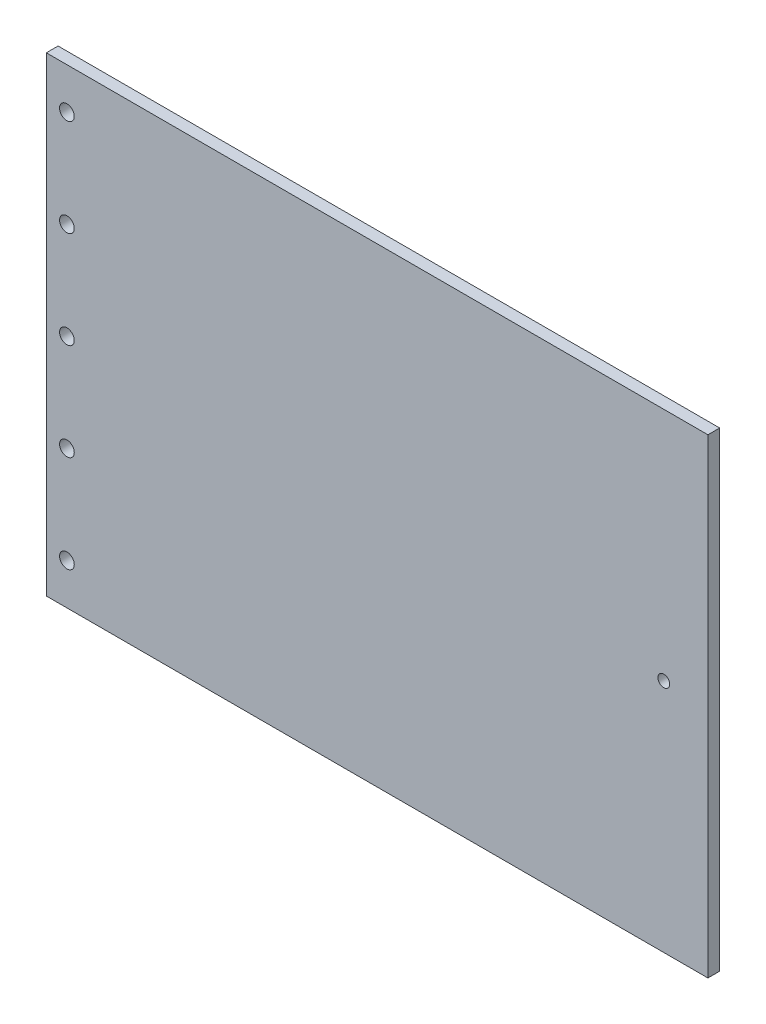
ISO-10303-21;
HEADER;
FILE_DESCRIPTION(('STEP AP214'),'2;1');
FILE_NAME('part.step','',(''),(''),'','','');
FILE_SCHEMA(('AUTOMOTIVE_DESIGN { 1 0 10303 214 1 1 1 1 }'));
ENDSEC;
DATA;
#1=APPLICATION_CONTEXT('core data for automotive mechanical design processes');
#2=APPLICATION_PROTOCOL_DEFINITION('international standard','automotive_design',2000,#1);
#3=PRODUCT_CONTEXT('',#1,'mechanical');
#4=PRODUCT('Part','Part','',(#3));
#5=PRODUCT_RELATED_PRODUCT_CATEGORY('part','',(#4));
#6=PRODUCT_DEFINITION_FORMATION('','',#4);
#7=PRODUCT_DEFINITION_CONTEXT('part definition',#1,'design');
#8=PRODUCT_DEFINITION('design','',#6,#7);
#9=PRODUCT_DEFINITION_SHAPE('','',#8);
#10=(LENGTH_UNIT() NAMED_UNIT(*) SI_UNIT(.MILLI.,.METRE.));
#11=(NAMED_UNIT(*) PLANE_ANGLE_UNIT() SI_UNIT($,.RADIAN.));
#12=(NAMED_UNIT(*) SI_UNIT($,.STERADIAN.) SOLID_ANGLE_UNIT());
#13=UNCERTAINTY_MEASURE_WITH_UNIT(LENGTH_MEASURE(1.E-05),#10,'distance_accuracy_value','');
#14=(GEOMETRIC_REPRESENTATION_CONTEXT(3) GLOBAL_UNCERTAINTY_ASSIGNED_CONTEXT((#13)) GLOBAL_UNIT_ASSIGNED_CONTEXT((#10,
#11,#12)) REPRESENTATION_CONTEXT('',''));
#15=CARTESIAN_POINT('',(0.,0.,0.));
#16=DIRECTION('',(0.,0.,1.));
#17=DIRECTION('',(1.,0.,0.));
#18=AXIS2_PLACEMENT_3D('',#15,#16,#17);
#19=CARTESIAN_POINT('',(0.,0.,4.));
#20=DIRECTION('',(0.,0.,-1.));
#21=DIRECTION('',(-1.,0.,0.));
#22=AXIS2_PLACEMENT_3D('',#19,#20,#21);
#23=PLANE('',#22);
#24=CARTESIAN_POINT('',(210.,80.,4.));
#25=DIRECTION('',(0.,0.,1.));
#26=DIRECTION('',(1.,0.,0.));
#27=AXIS2_PLACEMENT_3D('',#24,#25,#26);
#28=CIRCLE('',#27,2.);
#29=CARTESIAN_POINT('',(212.,80.,4.));
#30=VERTEX_POINT('',#29);
#31=EDGE_CURVE('E144',#30,#30,#28,.T.);
#32=ORIENTED_EDGE('',*,*,#31,.F.);
#33=EDGE_LOOP('',(#32));
#34=FACE_BOUND('',#33,.T.);
#35=DIRECTION('',(0.,-1.,0.));
#36=VECTOR('',#35,1.);
#37=CARTESIAN_POINT('',(0.,0.,4.));
#38=LINE('',#37,#36);
#39=CARTESIAN_POINT('',(0.,160.,4.));
#40=VERTEX_POINT('',#39);
#41=CARTESIAN_POINT('',(0.,0.,4.));
#42=VERTEX_POINT('',#41);
#43=EDGE_CURVE('E87',#40,#42,#38,.T.);
#44=ORIENTED_EDGE('',*,*,#43,.T.);
#45=DIRECTION('',(1.,0.,0.));
#46=VECTOR('',#45,1.);
#47=CARTESIAN_POINT('',(0.,0.,4.));
#48=LINE('',#47,#46);
#49=CARTESIAN_POINT('',(225.,0.,4.));
#50=VERTEX_POINT('',#49);
#51=EDGE_CURVE('E82',#42,#50,#48,.T.);
#52=ORIENTED_EDGE('',*,*,#51,.T.);
#53=DIRECTION('',(0.,1.,0.));
#54=VECTOR('',#53,1.);
#55=CARTESIAN_POINT('',(225.,0.,4.));
#56=LINE('',#55,#54);
#57=CARTESIAN_POINT('',(225.,160.,4.));
#58=VERTEX_POINT('',#57);
#59=EDGE_CURVE('E85',#50,#58,#56,.T.);
#60=ORIENTED_EDGE('',*,*,#59,.T.);
#61=DIRECTION('',(-1.,0.,0.));
#62=VECTOR('',#61,1.);
#63=CARTESIAN_POINT('',(0.,160.,4.));
#64=LINE('',#63,#62);
#65=EDGE_CURVE('E52',#58,#40,#64,.T.);
#66=ORIENTED_EDGE('',*,*,#65,.T.);
#67=EDGE_LOOP('',(#44,#52,#60,#66));
#68=FACE_BOUND('',#67,.T.);
#69=CARTESIAN_POINT('',(7.,80.,4.));
#70=DIRECTION('',(0.,0.,1.));
#71=DIRECTION('',(1.,0.,0.));
#72=AXIS2_PLACEMENT_3D('',#69,#70,#71);
#73=CIRCLE('',#72,2.5);
#74=CARTESIAN_POINT('',(9.5,80.,4.));
#75=VERTEX_POINT('',#74);
#76=EDGE_CURVE('E102',#75,#75,#73,.T.);
#77=ORIENTED_EDGE('',*,*,#76,.F.);
#78=EDGE_LOOP('',(#77));
#79=FACE_BOUND('',#78,.T.);
#80=CARTESIAN_POINT('',(7.00000000000001,47.,4.));
#81=DIRECTION('',(0.,0.,1.));
#82=DIRECTION('',(1.,0.,0.));
#83=AXIS2_PLACEMENT_3D('',#80,#81,#82);
#84=CIRCLE('',#83,2.5);
#85=CARTESIAN_POINT('',(9.50000000000001,47.,4.));
#86=VERTEX_POINT('',#85);
#87=EDGE_CURVE('E117',#86,#86,#84,.T.);
#88=ORIENTED_EDGE('',*,*,#87,.F.);
#89=EDGE_LOOP('',(#88));
#90=FACE_BOUND('',#89,.T.);
#91=CARTESIAN_POINT('',(7.00000000000001,14.,4.));
#92=DIRECTION('',(0.,0.,1.));
#93=DIRECTION('',(1.,0.,0.));
#94=AXIS2_PLACEMENT_3D('',#91,#92,#93);
#95=CIRCLE('',#94,2.5);
#96=CARTESIAN_POINT('',(9.50000000000001,14.,4.));
#97=VERTEX_POINT('',#96);
#98=EDGE_CURVE('E123',#97,#97,#95,.T.);
#99=ORIENTED_EDGE('',*,*,#98,.F.);
#100=EDGE_LOOP('',(#99));
#101=FACE_BOUND('',#100,.T.);
#102=CARTESIAN_POINT('',(7.,113.,4.));
#103=DIRECTION('',(0.,0.,1.));
#104=DIRECTION('',(1.,0.,0.));
#105=AXIS2_PLACEMENT_3D('',#102,#103,#104);
#106=CIRCLE('',#105,2.5);
#107=CARTESIAN_POINT('',(9.5,113.,4.));
#108=VERTEX_POINT('',#107);
#109=EDGE_CURVE('E129',#108,#108,#106,.T.);
#110=ORIENTED_EDGE('',*,*,#109,.F.);
#111=EDGE_LOOP('',(#110));
#112=FACE_BOUND('',#111,.T.);
#113=CARTESIAN_POINT('',(7.,146.,4.));
#114=DIRECTION('',(0.,0.,1.));
#115=DIRECTION('',(1.,0.,0.));
#116=AXIS2_PLACEMENT_3D('',#113,#114,#115);
#117=CIRCLE('',#116,2.5);
#118=CARTESIAN_POINT('',(9.5,146.,4.));
#119=VERTEX_POINT('',#118);
#120=EDGE_CURVE('E135',#119,#119,#117,.T.);
#121=ORIENTED_EDGE('',*,*,#120,.F.);
#122=EDGE_LOOP('',(#121));
#123=FACE_BOUND('',#122,.T.);
#124=ADVANCED_FACE('F35',(#34,#68,#79,#90,#101,#112,#123),#23,.F.);
#125=CARTESIAN_POINT('',(0.,0.,0.));
#126=DIRECTION('',(0.,0.,-1.));
#127=DIRECTION('',(-1.,0.,0.));
#128=AXIS2_PLACEMENT_3D('',#125,#126,#127);
#129=PLANE('',#128);
#130=CARTESIAN_POINT('',(210.,80.,0.));
#131=DIRECTION('',(0.,0.,1.));
#132=DIRECTION('',(1.,0.,0.));
#133=AXIS2_PLACEMENT_3D('',#130,#131,#132);
#134=CIRCLE('',#133,2.);
#135=CARTESIAN_POINT('',(212.,80.,0.));
#136=VERTEX_POINT('',#135);
#137=EDGE_CURVE('E141',#136,#136,#134,.T.);
#138=ORIENTED_EDGE('',*,*,#137,.T.);
#139=EDGE_LOOP('',(#138));
#140=FACE_BOUND('',#139,.T.);
#141=CARTESIAN_POINT('',(7.,113.,0.));
#142=DIRECTION('',(0.,0.,1.));
#143=DIRECTION('',(1.,0.,0.));
#144=AXIS2_PLACEMENT_3D('',#141,#142,#143);
#145=CIRCLE('',#144,2.5);
#146=CARTESIAN_POINT('',(9.5,113.,0.));
#147=VERTEX_POINT('',#146);
#148=EDGE_CURVE('E132',#147,#147,#145,.T.);
#149=ORIENTED_EDGE('',*,*,#148,.T.);
#150=EDGE_LOOP('',(#149));
#151=FACE_BOUND('',#150,.T.);
#152=CARTESIAN_POINT('',(7.00000000000001,47.,0.));
#153=DIRECTION('',(0.,0.,1.));
#154=DIRECTION('',(1.,0.,0.));
#155=AXIS2_PLACEMENT_3D('',#152,#153,#154);
#156=CIRCLE('',#155,2.5);
#157=CARTESIAN_POINT('',(9.50000000000001,47.,0.));
#158=VERTEX_POINT('',#157);
#159=EDGE_CURVE('E120',#158,#158,#156,.T.);
#160=ORIENTED_EDGE('',*,*,#159,.T.);
#161=EDGE_LOOP('',(#160));
#162=FACE_BOUND('',#161,.T.);
#163=DIRECTION('',(0.,-1.,0.));
#164=VECTOR('',#163,1.);
#165=CARTESIAN_POINT('',(0.,0.,0.));
#166=LINE('',#165,#164);
#167=CARTESIAN_POINT('',(0.,160.,0.));
#168=VERTEX_POINT('',#167);
#169=CARTESIAN_POINT('',(0.,0.,0.));
#170=VERTEX_POINT('',#169);
#171=EDGE_CURVE('E99',#168,#170,#166,.T.);
#172=ORIENTED_EDGE('',*,*,#171,.F.);
#173=DIRECTION('',(-1.,0.,0.));
#174=VECTOR('',#173,1.);
#175=CARTESIAN_POINT('',(0.,160.,0.));
#176=LINE('',#175,#174);
#177=CARTESIAN_POINT('',(225.,160.,0.));
#178=VERTEX_POINT('',#177);
#179=EDGE_CURVE('E75',#178,#168,#176,.T.);
#180=ORIENTED_EDGE('',*,*,#179,.F.);
#181=DIRECTION('',(0.,1.,0.));
#182=VECTOR('',#181,1.);
#183=CARTESIAN_POINT('',(225.,0.,0.));
#184=LINE('',#183,#182);
#185=CARTESIAN_POINT('',(225.,0.,0.));
#186=VERTEX_POINT('',#185);
#187=EDGE_CURVE('E69',#186,#178,#184,.T.);
#188=ORIENTED_EDGE('',*,*,#187,.F.);
#189=DIRECTION('',(1.,0.,0.));
#190=VECTOR('',#189,1.);
#191=CARTESIAN_POINT('',(0.,0.,0.));
#192=LINE('',#191,#190);
#193=EDGE_CURVE('E91',#170,#186,#192,.T.);
#194=ORIENTED_EDGE('',*,*,#193,.F.);
#195=EDGE_LOOP('',(#172,#180,#188,#194));
#196=FACE_BOUND('',#195,.T.);
#197=CARTESIAN_POINT('',(7.,80.,0.));
#198=DIRECTION('',(0.,0.,1.));
#199=DIRECTION('',(1.,0.,0.));
#200=AXIS2_PLACEMENT_3D('',#197,#198,#199);
#201=CIRCLE('',#200,2.5);
#202=CARTESIAN_POINT('',(9.5,80.,0.));
#203=VERTEX_POINT('',#202);
#204=EDGE_CURVE('E114',#203,#203,#201,.T.);
#205=ORIENTED_EDGE('',*,*,#204,.T.);
#206=EDGE_LOOP('',(#205));
#207=FACE_BOUND('',#206,.T.);
#208=CARTESIAN_POINT('',(7.00000000000001,14.,0.));
#209=DIRECTION('',(0.,0.,1.));
#210=DIRECTION('',(1.,0.,0.));
#211=AXIS2_PLACEMENT_3D('',#208,#209,#210);
#212=CIRCLE('',#211,2.5);
#213=CARTESIAN_POINT('',(9.50000000000001,14.,0.));
#214=VERTEX_POINT('',#213);
#215=EDGE_CURVE('E126',#214,#214,#212,.T.);
#216=ORIENTED_EDGE('',*,*,#215,.T.);
#217=EDGE_LOOP('',(#216));
#218=FACE_BOUND('',#217,.T.);
#219=CARTESIAN_POINT('',(7.,146.,0.));
#220=DIRECTION('',(0.,0.,1.));
#221=DIRECTION('',(1.,0.,0.));
#222=AXIS2_PLACEMENT_3D('',#219,#220,#221);
#223=CIRCLE('',#222,2.5);
#224=CARTESIAN_POINT('',(9.5,146.,0.));
#225=VERTEX_POINT('',#224);
#226=EDGE_CURVE('E138',#225,#225,#223,.T.);
#227=ORIENTED_EDGE('',*,*,#226,.T.);
#228=EDGE_LOOP('',(#227));
#229=FACE_BOUND('',#228,.T.);
#230=ADVANCED_FACE('F110',(#140,#151,#162,#196,#207,#218,#229),#129,.T.);
#231=CARTESIAN_POINT('',(0.,0.,4.));
#232=DIRECTION('',(1.,0.,0.));
#233=DIRECTION('',(0.,0.,-1.));
#234=AXIS2_PLACEMENT_3D('',#231,#232,#233);
#235=PLANE('',#234);
#236=ORIENTED_EDGE('',*,*,#171,.T.);
#237=DIRECTION('',(0.,0.,-1.));
#238=VECTOR('',#237,1.);
#239=CARTESIAN_POINT('',(0.,0.,4.));
#240=LINE('',#239,#238);
#241=EDGE_CURVE('E11',#42,#170,#240,.T.);
#242=ORIENTED_EDGE('',*,*,#241,.F.);
#243=ORIENTED_EDGE('',*,*,#43,.F.);
#244=DIRECTION('',(0.,0.,-1.));
#245=VECTOR('',#244,1.);
#246=CARTESIAN_POINT('',(0.,160.,4.));
#247=LINE('',#246,#245);
#248=EDGE_CURVE('E95',#40,#168,#247,.T.);
#249=ORIENTED_EDGE('',*,*,#248,.T.);
#250=EDGE_LOOP('',(#236,#242,#243,#249));
#251=FACE_BOUND('',#250,.T.);
#252=ADVANCED_FACE('F37',(#251),#235,.F.);
#253=CARTESIAN_POINT('',(0.,0.,4.));
#254=DIRECTION('',(0.,1.,0.));
#255=DIRECTION('',(0.,0.,1.));
#256=AXIS2_PLACEMENT_3D('',#253,#254,#255);
#257=PLANE('',#256);
#258=ORIENTED_EDGE('',*,*,#193,.T.);
#259=DIRECTION('',(0.,0.,-1.));
#260=VECTOR('',#259,1.);
#261=CARTESIAN_POINT('',(225.,0.,4.));
#262=LINE('',#261,#260);
#263=EDGE_CURVE('E44',#50,#186,#262,.T.);
#264=ORIENTED_EDGE('',*,*,#263,.F.);
#265=ORIENTED_EDGE('',*,*,#51,.F.);
#266=ORIENTED_EDGE('',*,*,#241,.T.);
#267=EDGE_LOOP('',(#258,#264,#265,#266));
#268=FACE_BOUND('',#267,.T.);
#269=ADVANCED_FACE('F90',(#268),#257,.F.);
#270=CARTESIAN_POINT('',(225.,0.,4.));
#271=DIRECTION('',(-1.,0.,0.));
#272=DIRECTION('',(0.,0.,1.));
#273=AXIS2_PLACEMENT_3D('',#270,#271,#272);
#274=PLANE('',#273);
#275=ORIENTED_EDGE('',*,*,#187,.T.);
#276=DIRECTION('',(0.,0.,-1.));
#277=VECTOR('',#276,1.);
#278=CARTESIAN_POINT('',(225.,160.,4.));
#279=LINE('',#278,#277);
#280=EDGE_CURVE('E92',#58,#178,#279,.T.);
#281=ORIENTED_EDGE('',*,*,#280,.F.);
#282=ORIENTED_EDGE('',*,*,#59,.F.);
#283=ORIENTED_EDGE('',*,*,#263,.T.);
#284=EDGE_LOOP('',(#275,#281,#282,#283));
#285=FACE_BOUND('',#284,.T.);
#286=ADVANCED_FACE('F93',(#285),#274,.F.);
#287=CARTESIAN_POINT('',(0.,160.,4.));
#288=DIRECTION('',(0.,-1.,0.));
#289=DIRECTION('',(0.,0.,-1.));
#290=AXIS2_PLACEMENT_3D('',#287,#288,#289);
#291=PLANE('',#290);
#292=ORIENTED_EDGE('',*,*,#179,.T.);
#293=ORIENTED_EDGE('',*,*,#248,.F.);
#294=ORIENTED_EDGE('',*,*,#65,.F.);
#295=ORIENTED_EDGE('',*,*,#280,.T.);
#296=EDGE_LOOP('',(#292,#293,#294,#295));
#297=FACE_BOUND('',#296,.T.);
#298=ADVANCED_FACE('F107',(#297),#291,.F.);
#299=CARTESIAN_POINT('',(7.,80.,4.));
#300=DIRECTION('',(0.,0.,-1.));
#301=DIRECTION('',(-1.,0.,0.));
#302=AXIS2_PLACEMENT_3D('',#299,#300,#301);
#303=CYLINDRICAL_SURFACE('',#302,2.5);
#304=ORIENTED_EDGE('',*,*,#76,.T.);
#305=EDGE_LOOP('',(#304));
#306=FACE_BOUND('',#305,.T.);
#307=ORIENTED_EDGE('',*,*,#204,.F.);
#308=EDGE_LOOP('',(#307));
#309=FACE_BOUND('',#308,.T.);
#310=ADVANCED_FACE('F167',(#306,#309),#303,.F.);
#311=CARTESIAN_POINT('',(7.00000000000001,47.,4.));
#312=DIRECTION('',(0.,0.,-1.));
#313=DIRECTION('',(-1.,0.,0.));
#314=AXIS2_PLACEMENT_3D('',#311,#312,#313);
#315=CYLINDRICAL_SURFACE('',#314,2.5);
#316=ORIENTED_EDGE('',*,*,#87,.T.);
#317=EDGE_LOOP('',(#316));
#318=FACE_BOUND('',#317,.T.);
#319=ORIENTED_EDGE('',*,*,#159,.F.);
#320=EDGE_LOOP('',(#319));
#321=FACE_BOUND('',#320,.T.);
#322=ADVANCED_FACE('F216',(#318,#321),#315,.F.);
#323=CARTESIAN_POINT('',(7.00000000000001,14.,4.));
#324=DIRECTION('',(0.,0.,-1.));
#325=DIRECTION('',(-1.,0.,0.));
#326=AXIS2_PLACEMENT_3D('',#323,#324,#325);
#327=CYLINDRICAL_SURFACE('',#326,2.5);
#328=ORIENTED_EDGE('',*,*,#98,.T.);
#329=EDGE_LOOP('',(#328));
#330=FACE_BOUND('',#329,.T.);
#331=ORIENTED_EDGE('',*,*,#215,.F.);
#332=EDGE_LOOP('',(#331));
#333=FACE_BOUND('',#332,.T.);
#334=ADVANCED_FACE('F208',(#330,#333),#327,.F.);
#335=CARTESIAN_POINT('',(7.,113.,4.));
#336=DIRECTION('',(0.,0.,-1.));
#337=DIRECTION('',(-1.,0.,0.));
#338=AXIS2_PLACEMENT_3D('',#335,#336,#337);
#339=CYLINDRICAL_SURFACE('',#338,2.5);
#340=ORIENTED_EDGE('',*,*,#109,.T.);
#341=EDGE_LOOP('',(#340));
#342=FACE_BOUND('',#341,.T.);
#343=ORIENTED_EDGE('',*,*,#148,.F.);
#344=EDGE_LOOP('',(#343));
#345=FACE_BOUND('',#344,.T.);
#346=ADVANCED_FACE('F201',(#342,#345),#339,.F.);
#347=CARTESIAN_POINT('',(7.,146.,4.));
#348=DIRECTION('',(0.,0.,-1.));
#349=DIRECTION('',(-1.,0.,0.));
#350=AXIS2_PLACEMENT_3D('',#347,#348,#349);
#351=CYLINDRICAL_SURFACE('',#350,2.5);
#352=ORIENTED_EDGE('',*,*,#120,.T.);
#353=EDGE_LOOP('',(#352));
#354=FACE_BOUND('',#353,.T.);
#355=ORIENTED_EDGE('',*,*,#226,.F.);
#356=EDGE_LOOP('',(#355));
#357=FACE_BOUND('',#356,.T.);
#358=ADVANCED_FACE('F155',(#354,#357),#351,.F.);
#359=CARTESIAN_POINT('',(210.,80.,0.));
#360=DIRECTION('',(0.,0.,1.));
#361=DIRECTION('',(1.,0.,0.));
#362=AXIS2_PLACEMENT_3D('',#359,#360,#361);
#363=CYLINDRICAL_SURFACE('',#362,2.);
#364=ORIENTED_EDGE('',*,*,#137,.F.);
#365=EDGE_LOOP('',(#364));
#366=FACE_BOUND('',#365,.T.);
#367=ORIENTED_EDGE('',*,*,#31,.T.);
#368=EDGE_LOOP('',(#367));
#369=FACE_BOUND('',#368,.T.);
#370=ADVANCED_FACE('F152',(#366,#369),#363,.F.);
#371=CLOSED_SHELL('',(#124,#230,#252,#269,#286,#298,#310,#322,#334,#346,#358,#370));
#372=MANIFOLD_SOLID_BREP('B2',#371);
#373=ADVANCED_BREP_SHAPE_REPRESENTATION('',(#18,#372),#14);
#374=SHAPE_DEFINITION_REPRESENTATION(#9,#373);
ENDSEC;
END-ISO-10303-21;
